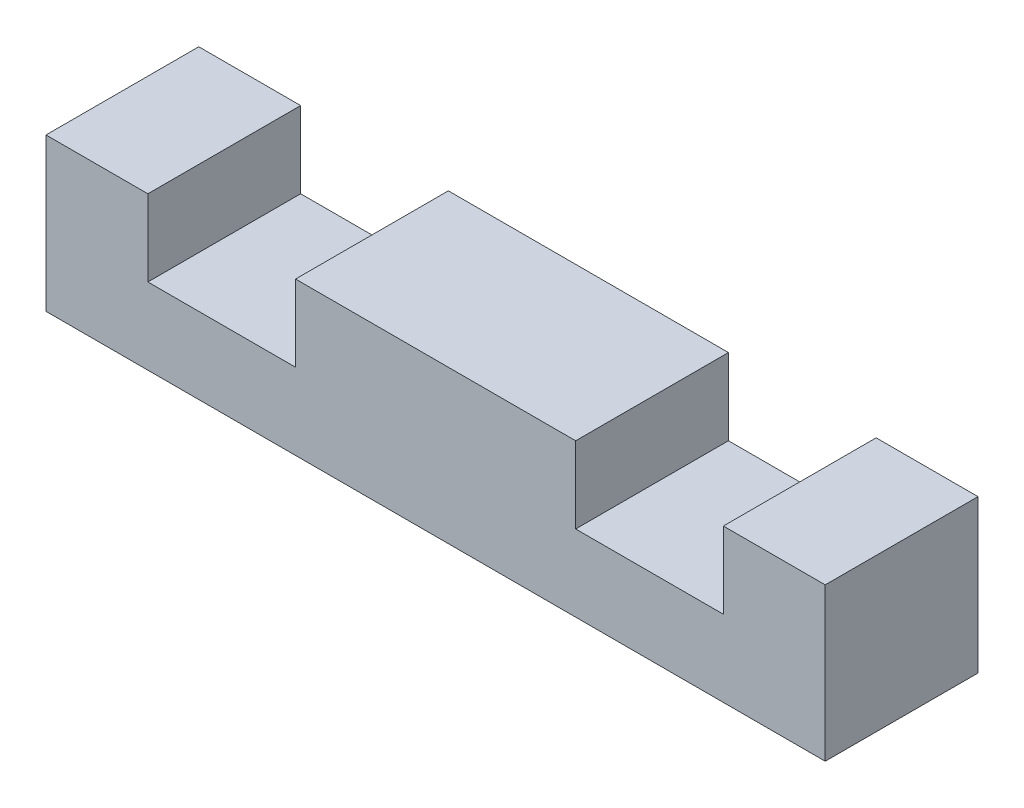
ISO-10303-21;
HEADER;
FILE_DESCRIPTION(('STEP AP214'),'2;1');
FILE_NAME('part.step','',(''),(''),'','','');
FILE_SCHEMA(('AUTOMOTIVE_DESIGN { 1 0 10303 214 1 1 1 1 }'));
ENDSEC;
DATA;
#1=APPLICATION_CONTEXT('core data for automotive mechanical design processes');
#2=APPLICATION_PROTOCOL_DEFINITION('international standard','automotive_design',2000,#1);
#3=PRODUCT_CONTEXT('',#1,'mechanical');
#4=PRODUCT('Part','Part','',(#3));
#5=PRODUCT_RELATED_PRODUCT_CATEGORY('part','',(#4));
#6=PRODUCT_DEFINITION_FORMATION('','',#4);
#7=PRODUCT_DEFINITION_CONTEXT('part definition',#1,'design');
#8=PRODUCT_DEFINITION('design','',#6,#7);
#9=PRODUCT_DEFINITION_SHAPE('','',#8);
#10=(LENGTH_UNIT() NAMED_UNIT(*) SI_UNIT(.MILLI.,.METRE.));
#11=(NAMED_UNIT(*) PLANE_ANGLE_UNIT() SI_UNIT($,.RADIAN.));
#12=(NAMED_UNIT(*) SI_UNIT($,.STERADIAN.) SOLID_ANGLE_UNIT());
#13=UNCERTAINTY_MEASURE_WITH_UNIT(LENGTH_MEASURE(1.E-05),#10,'distance_accuracy_value','');
#14=(GEOMETRIC_REPRESENTATION_CONTEXT(3) GLOBAL_UNCERTAINTY_ASSIGNED_CONTEXT((#13)) GLOBAL_UNIT_ASSIGNED_CONTEXT((#10,
#11,#12)) REPRESENTATION_CONTEXT('',''));
#15=CARTESIAN_POINT('',(0.,0.,0.));
#16=DIRECTION('',(0.,0.,1.));
#17=DIRECTION('',(1.,0.,0.));
#18=AXIS2_PLACEMENT_3D('',#15,#16,#17);
#19=CARTESIAN_POINT('',(30.6,0.,6.));
#20=DIRECTION('',(0.,1.,0.));
#21=DIRECTION('',(-1.,0.,0.));
#22=AXIS2_PLACEMENT_3D('',#19,#20,#21);
#23=PLANE('',#22);
#24=DIRECTION('',(1.,0.,0.));
#25=VECTOR('',#24,1.);
#26=CARTESIAN_POINT('',(30.6,0.,0.));
#27=LINE('',#26,#25);
#28=CARTESIAN_POINT('',(0.,0.,0.));
#29=VERTEX_POINT('',#28);
#30=CARTESIAN_POINT('',(30.6,0.,0.));
#31=VERTEX_POINT('',#30);
#32=EDGE_CURVE('E172',#29,#31,#27,.T.);
#33=ORIENTED_EDGE('',*,*,#32,.T.);
#34=DIRECTION('',(0.,0.,-1.));
#35=VECTOR('',#34,1.);
#36=CARTESIAN_POINT('',(30.6,0.,6.));
#37=LINE('',#36,#35);
#38=CARTESIAN_POINT('',(30.6,0.,6.));
#39=VERTEX_POINT('',#38);
#40=EDGE_CURVE('E11',#39,#31,#37,.T.);
#41=ORIENTED_EDGE('',*,*,#40,.F.);
#42=DIRECTION('',(1.,0.,0.));
#43=VECTOR('',#42,1.);
#44=CARTESIAN_POINT('',(30.6,0.,6.));
#45=LINE('',#44,#43);
#46=CARTESIAN_POINT('',(0.,0.,6.));
#47=VERTEX_POINT('',#46);
#48=EDGE_CURVE('E206',#47,#39,#45,.T.);
#49=ORIENTED_EDGE('',*,*,#48,.F.);
#50=DIRECTION('',(0.,0.,-1.));
#51=VECTOR('',#50,1.);
#52=CARTESIAN_POINT('',(0.,0.,6.));
#53=LINE('',#52,#51);
#54=EDGE_CURVE('E168',#47,#29,#53,.T.);
#55=ORIENTED_EDGE('',*,*,#54,.T.);
#56=EDGE_LOOP('',(#33,#41,#49,#55));
#57=FACE_BOUND('',#56,.T.);
#58=ADVANCED_FACE('F45',(#57),#23,.F.);
#59=CARTESIAN_POINT('',(30.6,6.,6.));
#60=DIRECTION('',(-1.,0.,0.));
#61=DIRECTION('',(0.,0.,1.));
#62=AXIS2_PLACEMENT_3D('',#59,#60,#61);
#63=PLANE('',#62);
#64=DIRECTION('',(0.,1.,0.));
#65=VECTOR('',#64,1.);
#66=CARTESIAN_POINT('',(30.6,6.,0.));
#67=LINE('',#66,#65);
#68=CARTESIAN_POINT('',(30.6,6.,0.));
#69=VERTEX_POINT('',#68);
#70=EDGE_CURVE('E176',#31,#69,#67,.T.);
#71=ORIENTED_EDGE('',*,*,#70,.T.);
#72=DIRECTION('',(0.,0.,-1.));
#73=VECTOR('',#72,1.);
#74=CARTESIAN_POINT('',(30.6,6.,6.));
#75=LINE('',#74,#73);
#76=CARTESIAN_POINT('',(30.6,6.,6.));
#77=VERTEX_POINT('',#76);
#78=EDGE_CURVE('E54',#77,#69,#75,.T.);
#79=ORIENTED_EDGE('',*,*,#78,.F.);
#80=DIRECTION('',(0.,1.,0.));
#81=VECTOR('',#80,1.);
#82=CARTESIAN_POINT('',(30.6,6.,6.));
#83=LINE('',#82,#81);
#84=EDGE_CURVE('E117',#39,#77,#83,.T.);
#85=ORIENTED_EDGE('',*,*,#84,.F.);
#86=ORIENTED_EDGE('',*,*,#40,.T.);
#87=EDGE_LOOP('',(#71,#79,#85,#86));
#88=FACE_BOUND('',#87,.T.);
#89=ADVANCED_FACE('F297',(#88),#63,.F.);
#90=CARTESIAN_POINT('',(26.6,6.,6.));
#91=DIRECTION('',(0.,-1.,0.));
#92=DIRECTION('',(0.,0.,-1.));
#93=AXIS2_PLACEMENT_3D('',#90,#91,#92);
#94=PLANE('',#93);
#95=DIRECTION('',(-1.,0.,0.));
#96=VECTOR('',#95,1.);
#97=CARTESIAN_POINT('',(26.6,6.,0.));
#98=LINE('',#97,#96);
#99=CARTESIAN_POINT('',(26.6,6.,0.));
#100=VERTEX_POINT('',#99);
#101=EDGE_CURVE('E179',#69,#100,#98,.T.);
#102=ORIENTED_EDGE('',*,*,#101,.T.);
#103=DIRECTION('',(0.,0.,-1.));
#104=VECTOR('',#103,1.);
#105=CARTESIAN_POINT('',(26.6,6.,6.));
#106=LINE('',#105,#104);
#107=CARTESIAN_POINT('',(26.6,6.,6.));
#108=VERTEX_POINT('',#107);
#109=EDGE_CURVE('E232',#108,#100,#106,.T.);
#110=ORIENTED_EDGE('',*,*,#109,.F.);
#111=DIRECTION('',(-1.,0.,0.));
#112=VECTOR('',#111,1.);
#113=CARTESIAN_POINT('',(26.6,6.,6.));
#114=LINE('',#113,#112);
#115=EDGE_CURVE('E242',#77,#108,#114,.T.);
#116=ORIENTED_EDGE('',*,*,#115,.F.);
#117=ORIENTED_EDGE('',*,*,#78,.T.);
#118=EDGE_LOOP('',(#102,#110,#116,#117));
#119=FACE_BOUND('',#118,.T.);
#120=ADVANCED_FACE('F240',(#119),#94,.F.);
#121=CARTESIAN_POINT('',(26.6,3.,6.));
#122=DIRECTION('',(1.,0.,0.));
#123=DIRECTION('',(0.,0.,-1.));
#124=AXIS2_PLACEMENT_3D('',#121,#122,#123);
#125=PLANE('',#124);
#126=DIRECTION('',(0.,-1.,0.));
#127=VECTOR('',#126,1.);
#128=CARTESIAN_POINT('',(26.6,3.,0.));
#129=LINE('',#128,#127);
#130=CARTESIAN_POINT('',(26.6,3.,0.));
#131=VERTEX_POINT('',#130);
#132=EDGE_CURVE('E182',#100,#131,#129,.T.);
#133=ORIENTED_EDGE('',*,*,#132,.T.);
#134=DIRECTION('',(0.,0.,-1.));
#135=VECTOR('',#134,1.);
#136=CARTESIAN_POINT('',(26.6,3.,6.));
#137=LINE('',#136,#135);
#138=CARTESIAN_POINT('',(26.6,3.,6.));
#139=VERTEX_POINT('',#138);
#140=EDGE_CURVE('E228',#139,#131,#137,.T.);
#141=ORIENTED_EDGE('',*,*,#140,.F.);
#142=DIRECTION('',(0.,-1.,0.));
#143=VECTOR('',#142,1.);
#144=CARTESIAN_POINT('',(26.6,3.,6.));
#145=LINE('',#144,#143);
#146=EDGE_CURVE('E261',#108,#139,#145,.T.);
#147=ORIENTED_EDGE('',*,*,#146,.F.);
#148=ORIENTED_EDGE('',*,*,#109,.T.);
#149=EDGE_LOOP('',(#133,#141,#147,#148));
#150=FACE_BOUND('',#149,.T.);
#151=ADVANCED_FACE('F251',(#150),#125,.F.);
#152=CARTESIAN_POINT('',(20.8,3.,6.));
#153=DIRECTION('',(0.,-1.,0.));
#154=DIRECTION('',(0.,0.,-1.));
#155=AXIS2_PLACEMENT_3D('',#152,#153,#154);
#156=PLANE('',#155);
#157=DIRECTION('',(-1.,0.,0.));
#158=VECTOR('',#157,1.);
#159=CARTESIAN_POINT('',(20.8,3.,0.));
#160=LINE('',#159,#158);
#161=CARTESIAN_POINT('',(20.8,3.,0.));
#162=VERTEX_POINT('',#161);
#163=EDGE_CURVE('E185',#131,#162,#160,.T.);
#164=ORIENTED_EDGE('',*,*,#163,.T.);
#165=DIRECTION('',(0.,0.,-1.));
#166=VECTOR('',#165,1.);
#167=CARTESIAN_POINT('',(20.8,3.,6.));
#168=LINE('',#167,#166);
#169=CARTESIAN_POINT('',(20.8,3.,6.));
#170=VERTEX_POINT('',#169);
#171=EDGE_CURVE('E224',#170,#162,#168,.T.);
#172=ORIENTED_EDGE('',*,*,#171,.F.);
#173=DIRECTION('',(-1.,0.,0.));
#174=VECTOR('',#173,1.);
#175=CARTESIAN_POINT('',(20.8,3.,6.));
#176=LINE('',#175,#174);
#177=EDGE_CURVE('E257',#139,#170,#176,.T.);
#178=ORIENTED_EDGE('',*,*,#177,.F.);
#179=ORIENTED_EDGE('',*,*,#140,.T.);
#180=EDGE_LOOP('',(#164,#172,#178,#179));
#181=FACE_BOUND('',#180,.T.);
#182=ADVANCED_FACE('F255',(#181),#156,.F.);
#183=CARTESIAN_POINT('',(20.8,6.,6.));
#184=DIRECTION('',(-1.,0.,0.));
#185=DIRECTION('',(0.,0.,1.));
#186=AXIS2_PLACEMENT_3D('',#183,#184,#185);
#187=PLANE('',#186);
#188=DIRECTION('',(0.,1.,0.));
#189=VECTOR('',#188,1.);
#190=CARTESIAN_POINT('',(20.8,6.,0.));
#191=LINE('',#190,#189);
#192=CARTESIAN_POINT('',(20.8,6.,0.));
#193=VERTEX_POINT('',#192);
#194=EDGE_CURVE('E188',#162,#193,#191,.T.);
#195=ORIENTED_EDGE('',*,*,#194,.T.);
#196=DIRECTION('',(0.,0.,-1.));
#197=VECTOR('',#196,1.);
#198=CARTESIAN_POINT('',(20.8,6.,6.));
#199=LINE('',#198,#197);
#200=CARTESIAN_POINT('',(20.8,6.,6.));
#201=VERTEX_POINT('',#200);
#202=EDGE_CURVE('E220',#201,#193,#199,.T.);
#203=ORIENTED_EDGE('',*,*,#202,.F.);
#204=DIRECTION('',(0.,1.,0.));
#205=VECTOR('',#204,1.);
#206=CARTESIAN_POINT('',(20.8,6.,6.));
#207=LINE('',#206,#205);
#208=EDGE_CURVE('E260',#170,#201,#207,.T.);
#209=ORIENTED_EDGE('',*,*,#208,.F.);
#210=ORIENTED_EDGE('',*,*,#171,.T.);
#211=EDGE_LOOP('',(#195,#203,#209,#210));
#212=FACE_BOUND('',#211,.T.);
#213=ADVANCED_FACE('F308',(#212),#187,.F.);
#214=CARTESIAN_POINT('',(9.8,6.,6.));
#215=DIRECTION('',(0.,-1.,0.));
#216=DIRECTION('',(0.,0.,-1.));
#217=AXIS2_PLACEMENT_3D('',#214,#215,#216);
#218=PLANE('',#217);
#219=DIRECTION('',(-1.,0.,0.));
#220=VECTOR('',#219,1.);
#221=CARTESIAN_POINT('',(9.8,6.,0.));
#222=LINE('',#221,#220);
#223=CARTESIAN_POINT('',(9.8,6.,0.));
#224=VERTEX_POINT('',#223);
#225=EDGE_CURVE('E191',#193,#224,#222,.T.);
#226=ORIENTED_EDGE('',*,*,#225,.T.);
#227=DIRECTION('',(0.,0.,-1.));
#228=VECTOR('',#227,1.);
#229=CARTESIAN_POINT('',(9.8,6.,6.));
#230=LINE('',#229,#228);
#231=CARTESIAN_POINT('',(9.8,6.,6.));
#232=VERTEX_POINT('',#231);
#233=EDGE_CURVE('E216',#232,#224,#230,.T.);
#234=ORIENTED_EDGE('',*,*,#233,.F.);
#235=DIRECTION('',(-1.,0.,0.));
#236=VECTOR('',#235,1.);
#237=CARTESIAN_POINT('',(9.8,6.,6.));
#238=LINE('',#237,#236);
#239=EDGE_CURVE('E265',#201,#232,#238,.T.);
#240=ORIENTED_EDGE('',*,*,#239,.F.);
#241=ORIENTED_EDGE('',*,*,#202,.T.);
#242=EDGE_LOOP('',(#226,#234,#240,#241));
#243=FACE_BOUND('',#242,.T.);
#244=ADVANCED_FACE('F311',(#243),#218,.F.);
#245=CARTESIAN_POINT('',(9.8,3.,6.));
#246=DIRECTION('',(1.,0.,0.));
#247=DIRECTION('',(0.,0.,-1.));
#248=AXIS2_PLACEMENT_3D('',#245,#246,#247);
#249=PLANE('',#248);
#250=DIRECTION('',(0.,-1.,0.));
#251=VECTOR('',#250,1.);
#252=CARTESIAN_POINT('',(9.8,3.,0.));
#253=LINE('',#252,#251);
#254=CARTESIAN_POINT('',(9.8,3.,0.));
#255=VERTEX_POINT('',#254);
#256=EDGE_CURVE('E194',#224,#255,#253,.T.);
#257=ORIENTED_EDGE('',*,*,#256,.T.);
#258=DIRECTION('',(0.,0.,-1.));
#259=VECTOR('',#258,1.);
#260=CARTESIAN_POINT('',(9.8,3.,6.));
#261=LINE('',#260,#259);
#262=CARTESIAN_POINT('',(9.8,3.,6.));
#263=VERTEX_POINT('',#262);
#264=EDGE_CURVE('E212',#263,#255,#261,.T.);
#265=ORIENTED_EDGE('',*,*,#264,.F.);
#266=DIRECTION('',(0.,-1.,0.));
#267=VECTOR('',#266,1.);
#268=CARTESIAN_POINT('',(9.8,3.,6.));
#269=LINE('',#268,#267);
#270=EDGE_CURVE('E273',#232,#263,#269,.T.);
#271=ORIENTED_EDGE('',*,*,#270,.F.);
#272=ORIENTED_EDGE('',*,*,#233,.T.);
#273=EDGE_LOOP('',(#257,#265,#271,#272));
#274=FACE_BOUND('',#273,.T.);
#275=ADVANCED_FACE('F279',(#274),#249,.F.);
#276=CARTESIAN_POINT('',(4.,3.,6.));
#277=DIRECTION('',(0.,-1.,0.));
#278=DIRECTION('',(0.,0.,-1.));
#279=AXIS2_PLACEMENT_3D('',#276,#277,#278);
#280=PLANE('',#279);
#281=DIRECTION('',(-1.,0.,0.));
#282=VECTOR('',#281,1.);
#283=CARTESIAN_POINT('',(4.,3.,0.));
#284=LINE('',#283,#282);
#285=CARTESIAN_POINT('',(4.,3.,0.));
#286=VERTEX_POINT('',#285);
#287=EDGE_CURVE('E197',#255,#286,#284,.T.);
#288=ORIENTED_EDGE('',*,*,#287,.T.);
#289=DIRECTION('',(0.,0.,-1.));
#290=VECTOR('',#289,1.);
#291=CARTESIAN_POINT('',(4.,3.,6.));
#292=LINE('',#291,#290);
#293=CARTESIAN_POINT('',(4.,3.,6.));
#294=VERTEX_POINT('',#293);
#295=EDGE_CURVE('E159',#294,#286,#292,.T.);
#296=ORIENTED_EDGE('',*,*,#295,.F.);
#297=DIRECTION('',(-1.,0.,0.));
#298=VECTOR('',#297,1.);
#299=CARTESIAN_POINT('',(4.,3.,6.));
#300=LINE('',#299,#298);
#301=EDGE_CURVE('E148',#263,#294,#300,.T.);
#302=ORIENTED_EDGE('',*,*,#301,.F.);
#303=ORIENTED_EDGE('',*,*,#264,.T.);
#304=EDGE_LOOP('',(#288,#296,#302,#303));
#305=FACE_BOUND('',#304,.T.);
#306=ADVANCED_FACE('F283',(#305),#280,.F.);
#307=CARTESIAN_POINT('',(4.,6.,6.));
#308=DIRECTION('',(-1.,0.,0.));
#309=DIRECTION('',(0.,-1.,0.));
#310=AXIS2_PLACEMENT_3D('',#307,#308,#309);
#311=PLANE('',#310);
#312=DIRECTION('',(0.,1.,0.));
#313=VECTOR('',#312,1.);
#314=CARTESIAN_POINT('',(4.,6.,0.));
#315=LINE('',#314,#313);
#316=CARTESIAN_POINT('',(4.,6.,0.));
#317=VERTEX_POINT('',#316);
#318=EDGE_CURVE('E157',#286,#317,#315,.T.);
#319=ORIENTED_EDGE('',*,*,#318,.T.);
#320=DIRECTION('',(0.,0.,-1.));
#321=VECTOR('',#320,1.);
#322=CARTESIAN_POINT('',(4.,6.,6.));
#323=LINE('',#322,#321);
#324=CARTESIAN_POINT('',(4.,6.,6.));
#325=VERTEX_POINT('',#324);
#326=EDGE_CURVE('E154',#325,#317,#323,.T.);
#327=ORIENTED_EDGE('',*,*,#326,.F.);
#328=DIRECTION('',(0.,1.,0.));
#329=VECTOR('',#328,1.);
#330=CARTESIAN_POINT('',(4.,6.,6.));
#331=LINE('',#330,#329);
#332=EDGE_CURVE('E142',#294,#325,#331,.T.);
#333=ORIENTED_EDGE('',*,*,#332,.F.);
#334=ORIENTED_EDGE('',*,*,#295,.T.);
#335=EDGE_LOOP('',(#319,#327,#333,#334));
#336=FACE_BOUND('',#335,.T.);
#337=ADVANCED_FACE('F155',(#336),#311,.F.);
#338=CARTESIAN_POINT('',(0.,6.,6.));
#339=DIRECTION('',(0.,-1.,0.));
#340=DIRECTION('',(0.,0.,-1.));
#341=AXIS2_PLACEMENT_3D('',#338,#339,#340);
#342=PLANE('',#341);
#343=DIRECTION('',(-1.,0.,0.));
#344=VECTOR('',#343,1.);
#345=CARTESIAN_POINT('',(0.,6.,0.));
#346=LINE('',#345,#344);
#347=CARTESIAN_POINT('',(0.,6.,0.));
#348=VERTEX_POINT('',#347);
#349=EDGE_CURVE('E103',#317,#348,#346,.T.);
#350=ORIENTED_EDGE('',*,*,#349,.T.);
#351=DIRECTION('',(0.,0.,-1.));
#352=VECTOR('',#351,1.);
#353=CARTESIAN_POINT('',(0.,6.,6.));
#354=LINE('',#353,#352);
#355=CARTESIAN_POINT('',(0.,6.,6.));
#356=VERTEX_POINT('',#355);
#357=EDGE_CURVE('E160',#356,#348,#354,.T.);
#358=ORIENTED_EDGE('',*,*,#357,.F.);
#359=DIRECTION('',(-1.,0.,0.));
#360=VECTOR('',#359,1.);
#361=CARTESIAN_POINT('',(0.,6.,6.));
#362=LINE('',#361,#360);
#363=EDGE_CURVE('E146',#325,#356,#362,.T.);
#364=ORIENTED_EDGE('',*,*,#363,.F.);
#365=ORIENTED_EDGE('',*,*,#326,.T.);
#366=EDGE_LOOP('',(#350,#358,#364,#365));
#367=FACE_BOUND('',#366,.T.);
#368=ADVANCED_FACE('F162',(#367),#342,.F.);
#369=CARTESIAN_POINT('',(0.,0.,6.));
#370=DIRECTION('',(1.,0.,0.));
#371=DIRECTION('',(0.,0.,-1.));
#372=AXIS2_PLACEMENT_3D('',#369,#370,#371);
#373=PLANE('',#372);
#374=DIRECTION('',(0.,-1.,0.));
#375=VECTOR('',#374,1.);
#376=CARTESIAN_POINT('',(0.,0.,0.));
#377=LINE('',#376,#375);
#378=EDGE_CURVE('E109',#348,#29,#377,.T.);
#379=ORIENTED_EDGE('',*,*,#378,.T.);
#380=ORIENTED_EDGE('',*,*,#54,.F.);
#381=DIRECTION('',(0.,-1.,0.));
#382=VECTOR('',#381,1.);
#383=CARTESIAN_POINT('',(0.,0.,6.));
#384=LINE('',#383,#382);
#385=EDGE_CURVE('E62',#356,#47,#384,.T.);
#386=ORIENTED_EDGE('',*,*,#385,.F.);
#387=ORIENTED_EDGE('',*,*,#357,.T.);
#388=EDGE_LOOP('',(#379,#380,#386,#387));
#389=FACE_BOUND('',#388,.T.);
#390=ADVANCED_FACE('F287',(#389),#373,.F.);
#391=CARTESIAN_POINT('',(0.,0.,6.));
#392=DIRECTION('',(0.,0.,-1.));
#393=DIRECTION('',(-1.,0.,0.));
#394=AXIS2_PLACEMENT_3D('',#391,#392,#393);
#395=PLANE('',#394);
#396=ORIENTED_EDGE('',*,*,#48,.T.);
#397=ORIENTED_EDGE('',*,*,#84,.T.);
#398=ORIENTED_EDGE('',*,*,#115,.T.);
#399=ORIENTED_EDGE('',*,*,#146,.T.);
#400=ORIENTED_EDGE('',*,*,#177,.T.);
#401=ORIENTED_EDGE('',*,*,#208,.T.);
#402=ORIENTED_EDGE('',*,*,#239,.T.);
#403=ORIENTED_EDGE('',*,*,#270,.T.);
#404=ORIENTED_EDGE('',*,*,#301,.T.);
#405=ORIENTED_EDGE('',*,*,#332,.T.);
#406=ORIENTED_EDGE('',*,*,#363,.T.);
#407=ORIENTED_EDGE('',*,*,#385,.T.);
#408=EDGE_LOOP('',(#396,#397,#398,#399,#400,#401,#402,#403,#404,#405,#406,#407));
#409=FACE_BOUND('',#408,.T.);
#410=ADVANCED_FACE('F144',(#409),#395,.F.);
#411=CARTESIAN_POINT('',(0.,0.,0.));
#412=DIRECTION('',(0.,0.,-1.));
#413=DIRECTION('',(-1.,0.,0.));
#414=AXIS2_PLACEMENT_3D('',#411,#412,#413);
#415=PLANE('',#414);
#416=ORIENTED_EDGE('',*,*,#32,.F.);
#417=ORIENTED_EDGE('',*,*,#378,.F.);
#418=ORIENTED_EDGE('',*,*,#349,.F.);
#419=ORIENTED_EDGE('',*,*,#318,.F.);
#420=ORIENTED_EDGE('',*,*,#287,.F.);
#421=ORIENTED_EDGE('',*,*,#256,.F.);
#422=ORIENTED_EDGE('',*,*,#225,.F.);
#423=ORIENTED_EDGE('',*,*,#194,.F.);
#424=ORIENTED_EDGE('',*,*,#163,.F.);
#425=ORIENTED_EDGE('',*,*,#132,.F.);
#426=ORIENTED_EDGE('',*,*,#101,.F.);
#427=ORIENTED_EDGE('',*,*,#70,.F.);
#428=EDGE_LOOP('',(#416,#417,#418,#419,#420,#421,#422,#423,#424,#425,#426,#427));
#429=FACE_BOUND('',#428,.T.);
#430=ADVANCED_FACE('F246',(#429),#415,.T.);
#431=CLOSED_SHELL('',(#58,#89,#120,#151,#182,#213,#244,#275,#306,#337,#368,#390,#410,#430));
#432=MANIFOLD_SOLID_BREP('B2',#431);
#433=ADVANCED_BREP_SHAPE_REPRESENTATION('',(#18,#432),#14);
#434=SHAPE_DEFINITION_REPRESENTATION(#9,#433);
ENDSEC;
END-ISO-10303-21;
